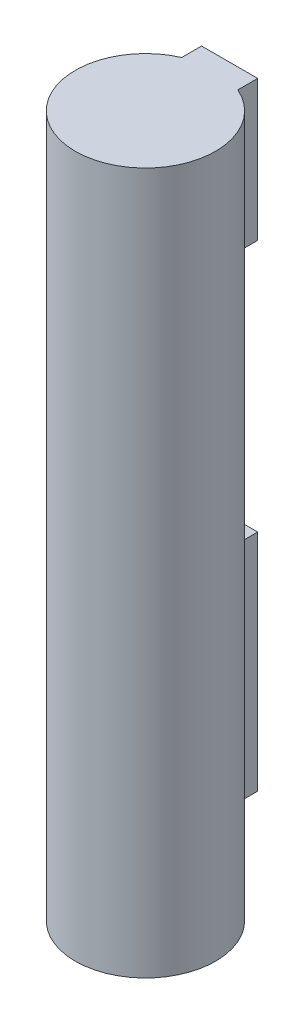
ISO-10303-21;
HEADER;
FILE_DESCRIPTION(('STEP AP214'),'2;1');
FILE_NAME('part.step','',(''),(''),'','','');
FILE_SCHEMA(('AUTOMOTIVE_DESIGN { 1 0 10303 214 1 1 1 1 }'));
ENDSEC;
DATA;
#1=APPLICATION_CONTEXT('core data for automotive mechanical design processes');
#2=APPLICATION_PROTOCOL_DEFINITION('international standard','automotive_design',2000,#1);
#3=PRODUCT_CONTEXT('',#1,'mechanical');
#4=PRODUCT('Part','Part','',(#3));
#5=PRODUCT_RELATED_PRODUCT_CATEGORY('part','',(#4));
#6=PRODUCT_DEFINITION_FORMATION('','',#4);
#7=PRODUCT_DEFINITION_CONTEXT('part definition',#1,'design');
#8=PRODUCT_DEFINITION('design','',#6,#7);
#9=PRODUCT_DEFINITION_SHAPE('','',#8);
#10=(LENGTH_UNIT() NAMED_UNIT(*) SI_UNIT(.MILLI.,.METRE.));
#11=(NAMED_UNIT(*) PLANE_ANGLE_UNIT() SI_UNIT($,.RADIAN.));
#12=(NAMED_UNIT(*) SI_UNIT($,.STERADIAN.) SOLID_ANGLE_UNIT());
#13=UNCERTAINTY_MEASURE_WITH_UNIT(LENGTH_MEASURE(1.E-05),#10,'distance_accuracy_value','');
#14=(GEOMETRIC_REPRESENTATION_CONTEXT(3) GLOBAL_UNCERTAINTY_ASSIGNED_CONTEXT((#13)) GLOBAL_UNIT_ASSIGNED_CONTEXT((#10,
#11,#12)) REPRESENTATION_CONTEXT('',''));
#15=CARTESIAN_POINT('',(0.,0.,0.));
#16=DIRECTION('',(0.,0.,1.));
#17=DIRECTION('',(1.,0.,0.));
#18=AXIS2_PLACEMENT_3D('',#15,#16,#17);
#19=CARTESIAN_POINT('',(0.,25.,0.));
#20=DIRECTION('',(0.,-1.,0.));
#21=DIRECTION('',(0.,0.,-1.));
#22=AXIS2_PLACEMENT_3D('',#19,#20,#21);
#23=CYLINDRICAL_SURFACE('',#22,2.5);
#24=CARTESIAN_POINT('',(0.,0.,0.));
#25=DIRECTION('',(0.,1.,0.));
#26=DIRECTION('',(0.,0.,1.));
#27=AXIS2_PLACEMENT_3D('',#24,#25,#26);
#28=CIRCLE('',#27,2.5);
#29=CARTESIAN_POINT('',(0.,0.,2.5));
#30=VERTEX_POINT('',#29);
#31=EDGE_CURVE('E159',#30,#30,#28,.T.);
#32=ORIENTED_EDGE('',*,*,#31,.T.);
#33=EDGE_LOOP('',(#32));
#34=FACE_BOUND('',#33,.T.);
#35=CARTESIAN_POINT('',(0.,20.,0.));
#36=DIRECTION('',(0.,-1.,0.));
#37=DIRECTION('',(0.,0.,1.));
#38=AXIS2_PLACEMENT_3D('',#35,#36,#37);
#39=CIRCLE('',#38,2.5);
#40=CARTESIAN_POINT('',(-1.,20.,-2.29128784747792));
#41=VERTEX_POINT('',#40);
#42=CARTESIAN_POINT('',(1.,20.,-2.29128784747792));
#43=VERTEX_POINT('',#42);
#44=EDGE_CURVE('E124',#41,#43,#39,.T.);
#45=ORIENTED_EDGE('',*,*,#44,.T.);
#46=DIRECTION('',(0.,1.,0.));
#47=VECTOR('',#46,1.);
#48=CARTESIAN_POINT('',(1.,20.,-2.29128784747792));
#49=LINE('',#48,#47);
#50=CARTESIAN_POINT('',(1.,25.,-2.29128784747792));
#51=VERTEX_POINT('',#50);
#52=EDGE_CURVE('E140',#43,#51,#49,.T.);
#53=ORIENTED_EDGE('',*,*,#52,.T.);
#54=CARTESIAN_POINT('',(0.,25.,0.));
#55=DIRECTION('',(0.,1.,0.));
#56=DIRECTION('',(0.,0.,1.));
#57=AXIS2_PLACEMENT_3D('',#54,#55,#56);
#58=CIRCLE('',#57,2.5);
#59=CARTESIAN_POINT('',(-1.,25.,-2.29128784747792));
#60=VERTEX_POINT('',#59);
#61=EDGE_CURVE('E162',#60,#51,#58,.T.);
#62=ORIENTED_EDGE('',*,*,#61,.F.);
#63=DIRECTION('',(0.,1.,0.));
#64=VECTOR('',#63,1.);
#65=CARTESIAN_POINT('',(-1.,20.,-2.29128784747792));
#66=LINE('',#65,#64);
#67=EDGE_CURVE('E114',#41,#60,#66,.T.);
#68=ORIENTED_EDGE('',*,*,#67,.F.);
#69=EDGE_LOOP('',(#45,#53,#62,#68));
#70=FACE_BOUND('',#69,.T.);
#71=CARTESIAN_POINT('',(0.,11.,0.));
#72=DIRECTION('',(0.,-1.,0.));
#73=DIRECTION('',(0.,0.,-1.));
#74=AXIS2_PLACEMENT_3D('',#71,#72,#73);
#75=CIRCLE('',#74,2.5);
#76=CARTESIAN_POINT('',(-1.,11.,-2.29128784747792));
#77=VERTEX_POINT('',#76);
#78=CARTESIAN_POINT('',(1.,11.,-2.29128784747792));
#79=VERTEX_POINT('',#78);
#80=EDGE_CURVE('E11',#77,#79,#75,.T.);
#81=ORIENTED_EDGE('',*,*,#80,.F.);
#82=DIRECTION('',(0.,-1.,0.));
#83=VECTOR('',#82,1.);
#84=CARTESIAN_POINT('',(-1.,25.,-2.29128784747792));
#85=LINE('',#84,#83);
#86=CARTESIAN_POINT('',(-1.,3.,-2.29128784747792));
#87=VERTEX_POINT('',#86);
#88=EDGE_CURVE('E48',#77,#87,#85,.T.);
#89=ORIENTED_EDGE('',*,*,#88,.T.);
#90=CARTESIAN_POINT('',(0.,3.,0.));
#91=DIRECTION('',(0.,-1.,0.));
#92=DIRECTION('',(0.,0.,-1.));
#93=AXIS2_PLACEMENT_3D('',#90,#91,#92);
#94=CIRCLE('',#93,2.5);
#95=CARTESIAN_POINT('',(1.,3.,-2.29128784747792));
#96=VERTEX_POINT('',#95);
#97=EDGE_CURVE('E164',#87,#96,#94,.T.);
#98=ORIENTED_EDGE('',*,*,#97,.T.);
#99=DIRECTION('',(0.,-1.,0.));
#100=VECTOR('',#99,1.);
#101=CARTESIAN_POINT('',(1.,25.,-2.29128784747792));
#102=LINE('',#101,#100);
#103=EDGE_CURVE('E169',#96,#79,#102,.F.);
#104=ORIENTED_EDGE('',*,*,#103,.T.);
#105=EDGE_LOOP('',(#81,#89,#98,#104));
#106=FACE_BOUND('',#105,.T.);
#107=ADVANCED_FACE('F41',(#34,#70,#106),#23,.T.);
#108=CARTESIAN_POINT('',(0.,25.,0.));
#109=DIRECTION('',(0.,1.,0.));
#110=DIRECTION('',(0.,0.,1.));
#111=AXIS2_PLACEMENT_3D('',#108,#109,#110);
#112=PLANE('',#111);
#113=ORIENTED_EDGE('',*,*,#61,.T.);
#114=DIRECTION('',(0.,0.,-1.));
#115=VECTOR('',#114,1.);
#116=CARTESIAN_POINT('',(1.,25.,-2.29128784747792));
#117=LINE('',#116,#115);
#118=CARTESIAN_POINT('',(1.,25.,-3.));
#119=VERTEX_POINT('',#118);
#120=EDGE_CURVE('E128',#51,#119,#117,.T.);
#121=ORIENTED_EDGE('',*,*,#120,.T.);
#122=DIRECTION('',(-1.,0.,0.));
#123=VECTOR('',#122,1.);
#124=CARTESIAN_POINT('',(1.,25.,-3.));
#125=LINE('',#124,#123);
#126=CARTESIAN_POINT('',(-1.,25.,-3.));
#127=VERTEX_POINT('',#126);
#128=EDGE_CURVE('E135',#119,#127,#125,.T.);
#129=ORIENTED_EDGE('',*,*,#128,.T.);
#130=DIRECTION('',(0.,0.,1.));
#131=VECTOR('',#130,1.);
#132=CARTESIAN_POINT('',(-1.,25.,-3.));
#133=LINE('',#132,#131);
#134=EDGE_CURVE('E55',#127,#60,#133,.T.);
#135=ORIENTED_EDGE('',*,*,#134,.T.);
#136=EDGE_LOOP('',(#113,#121,#129,#135));
#137=FACE_BOUND('',#136,.T.);
#138=ADVANCED_FACE('F198',(#137),#112,.T.);
#139=CARTESIAN_POINT('',(0.,0.,0.));
#140=DIRECTION('',(0.,1.,0.));
#141=DIRECTION('',(0.,0.,1.));
#142=AXIS2_PLACEMENT_3D('',#139,#140,#141);
#143=PLANE('',#142);
#144=ORIENTED_EDGE('',*,*,#31,.F.);
#145=EDGE_LOOP('',(#144));
#146=FACE_BOUND('',#145,.T.);
#147=ADVANCED_FACE('F203',(#146),#143,.F.);
#148=CARTESIAN_POINT('',(-1.,11.,-3.));
#149=DIRECTION('',(-1.,0.,0.));
#150=DIRECTION('',(0.,0.,1.));
#151=AXIS2_PLACEMENT_3D('',#148,#149,#150);
#152=PLANE('',#151);
#153=ORIENTED_EDGE('',*,*,#88,.F.);
#154=DIRECTION('',(0.,0.,-1.));
#155=VECTOR('',#154,1.);
#156=CARTESIAN_POINT('',(-1.,11.,-3.));
#157=LINE('',#156,#155);
#158=CARTESIAN_POINT('',(-1.,11.,-3.));
#159=VERTEX_POINT('',#158);
#160=EDGE_CURVE('E144',#77,#159,#157,.T.);
#161=ORIENTED_EDGE('',*,*,#160,.T.);
#162=DIRECTION('',(0.,-1.,0.));
#163=VECTOR('',#162,1.);
#164=CARTESIAN_POINT('',(-1.,11.,-3.));
#165=LINE('',#164,#163);
#166=CARTESIAN_POINT('',(-1.,3.,-3.));
#167=VERTEX_POINT('',#166);
#168=EDGE_CURVE('E152',#159,#167,#165,.T.);
#169=ORIENTED_EDGE('',*,*,#168,.T.);
#170=DIRECTION('',(0.,0.,-1.));
#171=VECTOR('',#170,1.);
#172=CARTESIAN_POINT('',(-1.,3.,-3.));
#173=LINE('',#172,#171);
#174=EDGE_CURVE('E139',#87,#167,#173,.T.);
#175=ORIENTED_EDGE('',*,*,#174,.F.);
#176=EDGE_LOOP('',(#153,#161,#169,#175));
#177=FACE_BOUND('',#176,.T.);
#178=ADVANCED_FACE('F177',(#177),#152,.T.);
#179=CARTESIAN_POINT('',(1.,11.,-3.));
#180=DIRECTION('',(1.,0.,0.));
#181=DIRECTION('',(0.,0.,-1.));
#182=AXIS2_PLACEMENT_3D('',#179,#180,#181);
#183=PLANE('',#182);
#184=ORIENTED_EDGE('',*,*,#103,.F.);
#185=DIRECTION('',(0.,0.,1.));
#186=VECTOR('',#185,1.);
#187=CARTESIAN_POINT('',(1.,3.,-3.));
#188=LINE('',#187,#186);
#189=CARTESIAN_POINT('',(1.,3.,-3.));
#190=VERTEX_POINT('',#189);
#191=EDGE_CURVE('E63',#190,#96,#188,.T.);
#192=ORIENTED_EDGE('',*,*,#191,.F.);
#193=DIRECTION('',(0.,-1.,0.));
#194=VECTOR('',#193,1.);
#195=CARTESIAN_POINT('',(1.,11.,-3.));
#196=LINE('',#195,#194);
#197=CARTESIAN_POINT('',(1.,11.,-3.));
#198=VERTEX_POINT('',#197);
#199=EDGE_CURVE('E157',#198,#190,#196,.T.);
#200=ORIENTED_EDGE('',*,*,#199,.F.);
#201=DIRECTION('',(0.,0.,1.));
#202=VECTOR('',#201,1.);
#203=CARTESIAN_POINT('',(1.,11.,-3.));
#204=LINE('',#203,#202);
#205=EDGE_CURVE('E149',#198,#79,#204,.T.);
#206=ORIENTED_EDGE('',*,*,#205,.T.);
#207=EDGE_LOOP('',(#184,#192,#200,#206));
#208=FACE_BOUND('',#207,.T.);
#209=ADVANCED_FACE('F263',(#208),#183,.T.);
#210=CARTESIAN_POINT('',(1.,11.,-3.));
#211=DIRECTION('',(0.,0.,-1.));
#212=DIRECTION('',(-1.,0.,0.));
#213=AXIS2_PLACEMENT_3D('',#210,#211,#212);
#214=PLANE('',#213);
#215=DIRECTION('',(1.,0.,0.));
#216=VECTOR('',#215,1.);
#217=CARTESIAN_POINT('',(1.,3.,-3.));
#218=LINE('',#217,#216);
#219=EDGE_CURVE('E154',#167,#190,#218,.T.);
#220=ORIENTED_EDGE('',*,*,#219,.F.);
#221=ORIENTED_EDGE('',*,*,#168,.F.);
#222=DIRECTION('',(1.,0.,0.));
#223=VECTOR('',#222,1.);
#224=CARTESIAN_POINT('',(1.,11.,-3.));
#225=LINE('',#224,#223);
#226=EDGE_CURVE('E146',#159,#198,#225,.T.);
#227=ORIENTED_EDGE('',*,*,#226,.T.);
#228=ORIENTED_EDGE('',*,*,#199,.T.);
#229=EDGE_LOOP('',(#220,#221,#227,#228));
#230=FACE_BOUND('',#229,.T.);
#231=ADVANCED_FACE('F185',(#230),#214,.T.);
#232=CARTESIAN_POINT('',(0.,11.,0.));
#233=DIRECTION('',(0.,-1.,0.));
#234=DIRECTION('',(0.,0.,-1.));
#235=AXIS2_PLACEMENT_3D('',#232,#233,#234);
#236=PLANE('',#235);
#237=ORIENTED_EDGE('',*,*,#160,.F.);
#238=ORIENTED_EDGE('',*,*,#80,.T.);
#239=ORIENTED_EDGE('',*,*,#205,.F.);
#240=ORIENTED_EDGE('',*,*,#226,.F.);
#241=EDGE_LOOP('',(#237,#238,#239,#240));
#242=FACE_BOUND('',#241,.T.);
#243=ADVANCED_FACE('F181',(#242),#236,.F.);
#244=CARTESIAN_POINT('',(0.,3.,0.));
#245=DIRECTION('',(0.,-1.,0.));
#246=DIRECTION('',(0.,0.,-1.));
#247=AXIS2_PLACEMENT_3D('',#244,#245,#246);
#248=PLANE('',#247);
#249=ORIENTED_EDGE('',*,*,#97,.F.);
#250=ORIENTED_EDGE('',*,*,#174,.T.);
#251=ORIENTED_EDGE('',*,*,#219,.T.);
#252=ORIENTED_EDGE('',*,*,#191,.T.);
#253=EDGE_LOOP('',(#249,#250,#251,#252));
#254=FACE_BOUND('',#253,.T.);
#255=ADVANCED_FACE('F186',(#254),#248,.T.);
#256=CARTESIAN_POINT('',(1.,20.,-3.));
#257=DIRECTION('',(0.,0.,-1.));
#258=DIRECTION('',(-1.,0.,0.));
#259=AXIS2_PLACEMENT_3D('',#256,#257,#258);
#260=PLANE('',#259);
#261=ORIENTED_EDGE('',*,*,#128,.F.);
#262=DIRECTION('',(0.,1.,0.));
#263=VECTOR('',#262,1.);
#264=CARTESIAN_POINT('',(1.,20.,-3.));
#265=LINE('',#264,#263);
#266=CARTESIAN_POINT('',(1.,20.,-3.));
#267=VERTEX_POINT('',#266);
#268=EDGE_CURVE('E127',#267,#119,#265,.T.);
#269=ORIENTED_EDGE('',*,*,#268,.F.);
#270=DIRECTION('',(-1.,0.,0.));
#271=VECTOR('',#270,1.);
#272=CARTESIAN_POINT('',(1.,20.,-3.));
#273=LINE('',#272,#271);
#274=CARTESIAN_POINT('',(-1.,20.,-3.));
#275=VERTEX_POINT('',#274);
#276=EDGE_CURVE('E121',#267,#275,#273,.T.);
#277=ORIENTED_EDGE('',*,*,#276,.T.);
#278=DIRECTION('',(0.,1.,0.));
#279=VECTOR('',#278,1.);
#280=CARTESIAN_POINT('',(-1.,20.,-3.));
#281=LINE('',#280,#279);
#282=EDGE_CURVE('E106',#275,#127,#281,.T.);
#283=ORIENTED_EDGE('',*,*,#282,.T.);
#284=EDGE_LOOP('',(#261,#269,#277,#283));
#285=FACE_BOUND('',#284,.T.);
#286=ADVANCED_FACE('F126',(#285),#260,.T.);
#287=CARTESIAN_POINT('',(1.,20.,-2.29128784747792));
#288=DIRECTION('',(1.,0.,0.));
#289=DIRECTION('',(0.,0.,-1.));
#290=AXIS2_PLACEMENT_3D('',#287,#288,#289);
#291=PLANE('',#290);
#292=ORIENTED_EDGE('',*,*,#120,.F.);
#293=ORIENTED_EDGE('',*,*,#52,.F.);
#294=DIRECTION('',(0.,0.,-1.));
#295=VECTOR('',#294,1.);
#296=CARTESIAN_POINT('',(1.,20.,-2.29128784747792));
#297=LINE('',#296,#295);
#298=EDGE_CURVE('E115',#43,#267,#297,.T.);
#299=ORIENTED_EDGE('',*,*,#298,.T.);
#300=ORIENTED_EDGE('',*,*,#268,.T.);
#301=EDGE_LOOP('',(#292,#293,#299,#300));
#302=FACE_BOUND('',#301,.T.);
#303=ADVANCED_FACE('F194',(#302),#291,.T.);
#304=CARTESIAN_POINT('',(-1.,20.,-3.));
#305=DIRECTION('',(-1.,0.,0.));
#306=DIRECTION('',(0.,0.,1.));
#307=AXIS2_PLACEMENT_3D('',#304,#305,#306);
#308=PLANE('',#307);
#309=ORIENTED_EDGE('',*,*,#134,.F.);
#310=ORIENTED_EDGE('',*,*,#282,.F.);
#311=DIRECTION('',(0.,0.,1.));
#312=VECTOR('',#311,1.);
#313=CARTESIAN_POINT('',(-1.,20.,-3.));
#314=LINE('',#313,#312);
#315=EDGE_CURVE('E109',#275,#41,#314,.T.);
#316=ORIENTED_EDGE('',*,*,#315,.T.);
#317=ORIENTED_EDGE('',*,*,#67,.T.);
#318=EDGE_LOOP('',(#309,#310,#316,#317));
#319=FACE_BOUND('',#318,.T.);
#320=ADVANCED_FACE('F108',(#319),#308,.T.);
#321=CARTESIAN_POINT('',(0.,20.,0.));
#322=DIRECTION('',(0.,1.,0.));
#323=DIRECTION('',(0.,0.,1.));
#324=AXIS2_PLACEMENT_3D('',#321,#322,#323);
#325=PLANE('',#324);
#326=ORIENTED_EDGE('',*,*,#276,.F.);
#327=ORIENTED_EDGE('',*,*,#298,.F.);
#328=ORIENTED_EDGE('',*,*,#44,.F.);
#329=ORIENTED_EDGE('',*,*,#315,.F.);
#330=EDGE_LOOP('',(#326,#327,#328,#329));
#331=FACE_BOUND('',#330,.T.);
#332=ADVANCED_FACE('F119',(#331),#325,.F.);
#333=CLOSED_SHELL('',(#107,#138,#147,#178,#209,#231,#243,#255,#286,#303,#320,#332));
#334=MANIFOLD_SOLID_BREP('B2',#333);
#335=ADVANCED_BREP_SHAPE_REPRESENTATION('',(#18,#334),#14);
#336=SHAPE_DEFINITION_REPRESENTATION(#9,#335);
ENDSEC;
END-ISO-10303-21;
